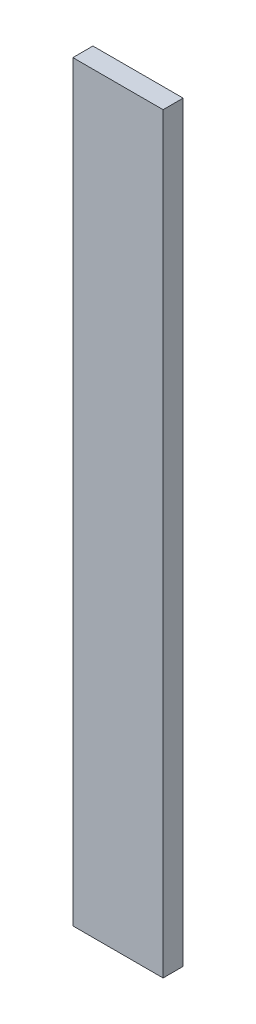
ISO-10303-21;
HEADER;
FILE_DESCRIPTION(('STEP AP214'),'2;1');
FILE_NAME('part.step','',(''),(''),'','','');
FILE_SCHEMA(('AUTOMOTIVE_DESIGN { 1 0 10303 214 1 1 1 1 }'));
ENDSEC;
DATA;
#1=APPLICATION_CONTEXT('core data for automotive mechanical design processes');
#2=APPLICATION_PROTOCOL_DEFINITION('international standard','automotive_design',2000,#1);
#3=PRODUCT_CONTEXT('',#1,'mechanical');
#4=PRODUCT('Part','Part','',(#3));
#5=PRODUCT_RELATED_PRODUCT_CATEGORY('part','',(#4));
#6=PRODUCT_DEFINITION_FORMATION('','',#4);
#7=PRODUCT_DEFINITION_CONTEXT('part definition',#1,'design');
#8=PRODUCT_DEFINITION('design','',#6,#7);
#9=PRODUCT_DEFINITION_SHAPE('','',#8);
#10=(LENGTH_UNIT() NAMED_UNIT(*) SI_UNIT(.MILLI.,.METRE.));
#11=(NAMED_UNIT(*) PLANE_ANGLE_UNIT() SI_UNIT($,.RADIAN.));
#12=(NAMED_UNIT(*) SI_UNIT($,.STERADIAN.) SOLID_ANGLE_UNIT());
#13=UNCERTAINTY_MEASURE_WITH_UNIT(LENGTH_MEASURE(1.E-05),#10,'distance_accuracy_value','');
#14=(GEOMETRIC_REPRESENTATION_CONTEXT(3) GLOBAL_UNCERTAINTY_ASSIGNED_CONTEXT((#13)) GLOBAL_UNIT_ASSIGNED_CONTEXT((#10,
#11,#12)) REPRESENTATION_CONTEXT('',''));
#15=CARTESIAN_POINT('',(0.,0.,0.));
#16=DIRECTION('',(0.,0.,1.));
#17=DIRECTION('',(1.,0.,0.));
#18=AXIS2_PLACEMENT_3D('',#15,#16,#17);
#19=CARTESIAN_POINT('',(0.,0.,100.));
#20=DIRECTION('',(1.,0.,0.));
#21=DIRECTION('',(0.,0.,-1.));
#22=AXIS2_PLACEMENT_3D('',#19,#20,#21);
#23=PLANE('',#22);
#24=DIRECTION('',(0.,-1.,0.));
#25=VECTOR('',#24,1.);
#26=CARTESIAN_POINT('',(0.,0.,0.));
#27=LINE('',#26,#25);
#28=CARTESIAN_POINT('',(0.,0.,0.));
#29=VERTEX_POINT('',#28);
#30=CARTESIAN_POINT('',(0.,-3750.,0.));
#31=VERTEX_POINT('',#30);
#32=EDGE_CURVE('E111',#29,#31,#27,.T.);
#33=ORIENTED_EDGE('',*,*,#32,.T.);
#34=DIRECTION('',(0.,0.,-1.));
#35=VECTOR('',#34,1.);
#36=CARTESIAN_POINT('',(0.,-3750.,100.));
#37=LINE('',#36,#35);
#38=CARTESIAN_POINT('',(0.,-3750.,100.));
#39=VERTEX_POINT('',#38);
#40=EDGE_CURVE('E11',#39,#31,#37,.T.);
#41=ORIENTED_EDGE('',*,*,#40,.F.);
#42=DIRECTION('',(0.,-1.,0.));
#43=VECTOR('',#42,1.);
#44=CARTESIAN_POINT('',(0.,0.,100.));
#45=LINE('',#44,#43);
#46=CARTESIAN_POINT('',(0.,0.,100.));
#47=VERTEX_POINT('',#46);
#48=EDGE_CURVE('E95',#47,#39,#45,.T.);
#49=ORIENTED_EDGE('',*,*,#48,.F.);
#50=DIRECTION('',(0.,0.,-1.));
#51=VECTOR('',#50,1.);
#52=CARTESIAN_POINT('',(0.,0.,100.));
#53=LINE('',#52,#51);
#54=EDGE_CURVE('E107',#47,#29,#53,.T.);
#55=ORIENTED_EDGE('',*,*,#54,.T.);
#56=EDGE_LOOP('',(#33,#41,#49,#55));
#57=FACE_BOUND('',#56,.T.);
#58=ADVANCED_FACE('F43',(#57),#23,.F.);
#59=CARTESIAN_POINT('',(0.,-3750.,100.));
#60=DIRECTION('',(0.,1.,0.));
#61=DIRECTION('',(0.,0.,1.));
#62=AXIS2_PLACEMENT_3D('',#59,#60,#61);
#63=PLANE('',#62);
#64=DIRECTION('',(1.,0.,0.));
#65=VECTOR('',#64,1.);
#66=CARTESIAN_POINT('',(0.,-3750.,0.));
#67=LINE('',#66,#65);
#68=CARTESIAN_POINT('',(450.,-3750.,0.));
#69=VERTEX_POINT('',#68);
#70=EDGE_CURVE('E100',#31,#69,#67,.T.);
#71=ORIENTED_EDGE('',*,*,#70,.T.);
#72=DIRECTION('',(0.,0.,-1.));
#73=VECTOR('',#72,1.);
#74=CARTESIAN_POINT('',(450.,-3750.,100.));
#75=LINE('',#74,#73);
#76=CARTESIAN_POINT('',(450.,-3750.,100.));
#77=VERTEX_POINT('',#76);
#78=EDGE_CURVE('E52',#77,#69,#75,.T.);
#79=ORIENTED_EDGE('',*,*,#78,.F.);
#80=DIRECTION('',(1.,0.,0.));
#81=VECTOR('',#80,1.);
#82=CARTESIAN_POINT('',(0.,-3750.,100.));
#83=LINE('',#82,#81);
#84=EDGE_CURVE('E90',#39,#77,#83,.T.);
#85=ORIENTED_EDGE('',*,*,#84,.F.);
#86=ORIENTED_EDGE('',*,*,#40,.T.);
#87=EDGE_LOOP('',(#71,#79,#85,#86));
#88=FACE_BOUND('',#87,.T.);
#89=ADVANCED_FACE('F99',(#88),#63,.F.);
#90=CARTESIAN_POINT('',(450.,0.,100.));
#91=DIRECTION('',(-1.,0.,0.));
#92=DIRECTION('',(0.,0.,1.));
#93=AXIS2_PLACEMENT_3D('',#90,#91,#92);
#94=PLANE('',#93);
#95=DIRECTION('',(0.,1.,0.));
#96=VECTOR('',#95,1.);
#97=CARTESIAN_POINT('',(450.,0.,0.));
#98=LINE('',#97,#96);
#99=CARTESIAN_POINT('',(450.,0.,0.));
#100=VERTEX_POINT('',#99);
#101=EDGE_CURVE('E77',#69,#100,#98,.T.);
#102=ORIENTED_EDGE('',*,*,#101,.T.);
#103=DIRECTION('',(0.,0.,-1.));
#104=VECTOR('',#103,1.);
#105=CARTESIAN_POINT('',(450.,0.,100.));
#106=LINE('',#105,#104);
#107=CARTESIAN_POINT('',(450.,0.,100.));
#108=VERTEX_POINT('',#107);
#109=EDGE_CURVE('E102',#108,#100,#106,.T.);
#110=ORIENTED_EDGE('',*,*,#109,.F.);
#111=DIRECTION('',(0.,1.,0.));
#112=VECTOR('',#111,1.);
#113=CARTESIAN_POINT('',(450.,0.,100.));
#114=LINE('',#113,#112);
#115=EDGE_CURVE('E93',#77,#108,#114,.T.);
#116=ORIENTED_EDGE('',*,*,#115,.F.);
#117=ORIENTED_EDGE('',*,*,#78,.T.);
#118=EDGE_LOOP('',(#102,#110,#116,#117));
#119=FACE_BOUND('',#118,.T.);
#120=ADVANCED_FACE('F103',(#119),#94,.F.);
#121=CARTESIAN_POINT('',(0.,0.,100.));
#122=DIRECTION('',(0.,-1.,0.));
#123=DIRECTION('',(0.,0.,-1.));
#124=AXIS2_PLACEMENT_3D('',#121,#122,#123);
#125=PLANE('',#124);
#126=DIRECTION('',(-1.,0.,0.));
#127=VECTOR('',#126,1.);
#128=CARTESIAN_POINT('',(0.,0.,0.));
#129=LINE('',#128,#127);
#130=EDGE_CURVE('E83',#100,#29,#129,.T.);
#131=ORIENTED_EDGE('',*,*,#130,.T.);
#132=ORIENTED_EDGE('',*,*,#54,.F.);
#133=DIRECTION('',(-1.,0.,0.));
#134=VECTOR('',#133,1.);
#135=CARTESIAN_POINT('',(0.,0.,100.));
#136=LINE('',#135,#134);
#137=EDGE_CURVE('E60',#108,#47,#136,.T.);
#138=ORIENTED_EDGE('',*,*,#137,.F.);
#139=ORIENTED_EDGE('',*,*,#109,.T.);
#140=EDGE_LOOP('',(#131,#132,#138,#139));
#141=FACE_BOUND('',#140,.T.);
#142=ADVANCED_FACE('F124',(#141),#125,.F.);
#143=CARTESIAN_POINT('',(0.,0.,100.));
#144=DIRECTION('',(0.,0.,1.));
#145=DIRECTION('',(1.,0.,0.));
#146=AXIS2_PLACEMENT_3D('',#143,#144,#145);
#147=PLANE('',#146);
#148=ORIENTED_EDGE('',*,*,#48,.T.);
#149=ORIENTED_EDGE('',*,*,#84,.T.);
#150=ORIENTED_EDGE('',*,*,#115,.T.);
#151=ORIENTED_EDGE('',*,*,#137,.T.);
#152=EDGE_LOOP('',(#148,#149,#150,#151));
#153=FACE_BOUND('',#152,.T.);
#154=ADVANCED_FACE('F91',(#153),#147,.T.);
#155=CARTESIAN_POINT('',(0.,0.,0.));
#156=DIRECTION('',(0.,0.,1.));
#157=DIRECTION('',(1.,0.,0.));
#158=AXIS2_PLACEMENT_3D('',#155,#156,#157);
#159=PLANE('',#158);
#160=ORIENTED_EDGE('',*,*,#32,.F.);
#161=ORIENTED_EDGE('',*,*,#130,.F.);
#162=ORIENTED_EDGE('',*,*,#101,.F.);
#163=ORIENTED_EDGE('',*,*,#70,.F.);
#164=EDGE_LOOP('',(#160,#161,#162,#163));
#165=FACE_BOUND('',#164,.T.);
#166=ADVANCED_FACE('F127',(#165),#159,.F.);
#167=CLOSED_SHELL('',(#58,#89,#120,#142,#154,#166));
#168=MANIFOLD_SOLID_BREP('B2',#167);
#169=ADVANCED_BREP_SHAPE_REPRESENTATION('',(#18,#168),#14);
#170=SHAPE_DEFINITION_REPRESENTATION(#9,#169);
ENDSEC;
END-ISO-10303-21;
